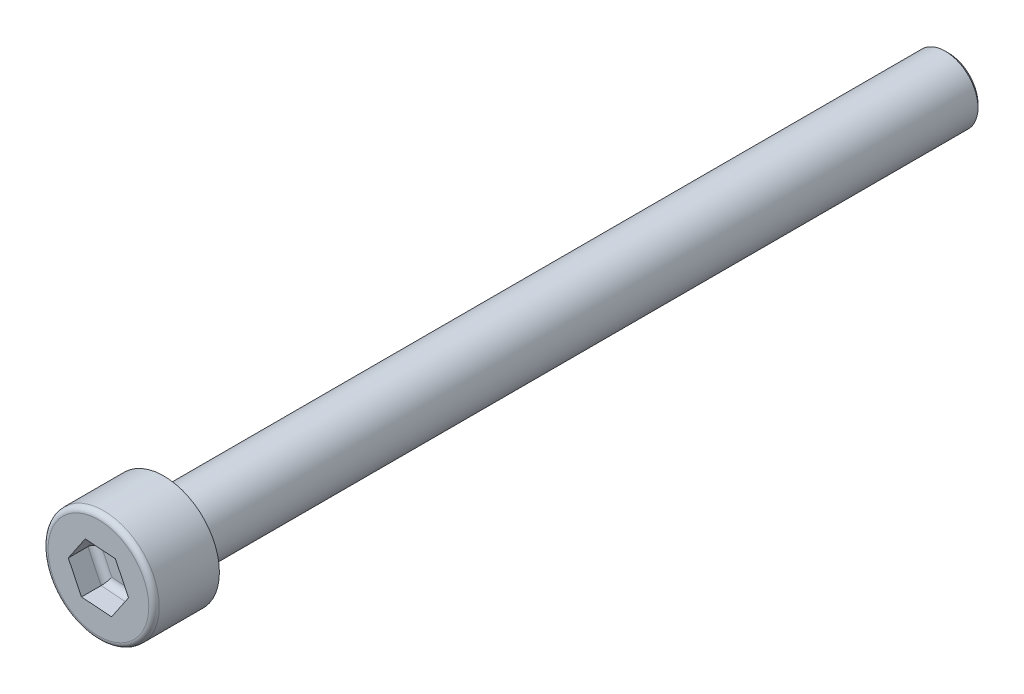
ISO-10303-21;
HEADER;
FILE_DESCRIPTION(('STEP AP214'),'2;1');
FILE_NAME('part.step','',(''),(''),'','','');
FILE_SCHEMA(('AUTOMOTIVE_DESIGN { 1 0 10303 214 1 1 1 1 }'));
ENDSEC;
DATA;
#1=APPLICATION_CONTEXT('core data for automotive mechanical design processes');
#2=APPLICATION_PROTOCOL_DEFINITION('international standard','automotive_design',2000,#1);
#3=PRODUCT_CONTEXT('',#1,'mechanical');
#4=PRODUCT('Part','Part','',(#3));
#5=PRODUCT_RELATED_PRODUCT_CATEGORY('part','',(#4));
#6=PRODUCT_DEFINITION_FORMATION('','',#4);
#7=PRODUCT_DEFINITION_CONTEXT('part definition',#1,'design');
#8=PRODUCT_DEFINITION('design','',#6,#7);
#9=PRODUCT_DEFINITION_SHAPE('','',#8);
#10=(LENGTH_UNIT() NAMED_UNIT(*) SI_UNIT(.MILLI.,.METRE.));
#11=(NAMED_UNIT(*) PLANE_ANGLE_UNIT() SI_UNIT($,.RADIAN.));
#12=(NAMED_UNIT(*) SI_UNIT($,.STERADIAN.) SOLID_ANGLE_UNIT());
#13=UNCERTAINTY_MEASURE_WITH_UNIT(LENGTH_MEASURE(1.E-05),#10,'distance_accuracy_value','');
#14=(GEOMETRIC_REPRESENTATION_CONTEXT(3) GLOBAL_UNCERTAINTY_ASSIGNED_CONTEXT((#13)) GLOBAL_UNIT_ASSIGNED_CONTEXT((#10,
#11,#12)) REPRESENTATION_CONTEXT('',''));
#15=CARTESIAN_POINT('',(0.,0.,0.));
#16=DIRECTION('',(0.,0.,1.));
#17=DIRECTION('',(1.,0.,0.));
#18=AXIS2_PLACEMENT_3D('',#15,#16,#17);
#19=CARTESIAN_POINT('',(0.,0.,60.));
#20=DIRECTION('',(0.,0.,-1.));
#21=DIRECTION('',(-1.,0.,0.));
#22=AXIS2_PLACEMENT_3D('',#19,#20,#21);
#23=CYLINDRICAL_SURFACE('',#22,2.5);
#24=CARTESIAN_POINT('',(0.,0.,0.25));
#25=DIRECTION('',(0.,0.,1.));
#26=DIRECTION('',(1.,0.,0.));
#27=AXIS2_PLACEMENT_3D('',#24,#25,#26);
#28=CIRCLE('',#27,2.5);
#29=CARTESIAN_POINT('',(2.5,0.,0.25));
#30=VERTEX_POINT('',#29);
#31=EDGE_CURVE('E154',#30,#30,#28,.T.);
#32=ORIENTED_EDGE('',*,*,#31,.T.);
#33=EDGE_LOOP('',(#32));
#34=FACE_BOUND('',#33,.T.);
#35=CARTESIAN_POINT('',(0.,0.,60.));
#36=DIRECTION('',(0.,0.,1.));
#37=DIRECTION('',(1.,0.,0.));
#38=AXIS2_PLACEMENT_3D('',#35,#36,#37);
#39=CIRCLE('',#38,2.5);
#40=CARTESIAN_POINT('',(2.5,0.,60.));
#41=VERTEX_POINT('',#40);
#42=EDGE_CURVE('E145',#41,#41,#39,.T.);
#43=ORIENTED_EDGE('',*,*,#42,.F.);
#44=EDGE_LOOP('',(#43));
#45=FACE_BOUND('',#44,.T.);
#46=ADVANCED_FACE('F32',(#34,#45),#23,.T.);
#47=CARTESIAN_POINT('',(0.,0.,0.));
#48=DIRECTION('',(0.,0.,1.));
#49=DIRECTION('',(1.,0.,0.));
#50=AXIS2_PLACEMENT_3D('',#47,#48,#49);
#51=PLANE('',#50);
#52=CARTESIAN_POINT('',(0.,0.,0.));
#53=DIRECTION('',(0.,0.,1.));
#54=DIRECTION('',(1.,0.,0.));
#55=AXIS2_PLACEMENT_3D('',#52,#53,#54);
#56=CIRCLE('',#55,2.25);
#57=CARTESIAN_POINT('',(2.25,0.,0.));
#58=VERTEX_POINT('',#57);
#59=EDGE_CURVE('E157',#58,#58,#56,.F.);
#60=ORIENTED_EDGE('',*,*,#59,.T.);
#61=EDGE_LOOP('',(#60));
#62=FACE_BOUND('',#61,.T.);
#63=ADVANCED_FACE('F247',(#62),#51,.F.);
#64=CARTESIAN_POINT('',(0.,0.,60.));
#65=DIRECTION('',(0.,0.,1.));
#66=DIRECTION('',(1.,0.,0.));
#67=AXIS2_PLACEMENT_3D('',#64,#65,#66);
#68=PLANE('',#67);
#69=CARTESIAN_POINT('',(0.,0.,60.));
#70=DIRECTION('',(0.,0.,1.));
#71=DIRECTION('',(1.,0.,0.));
#72=AXIS2_PLACEMENT_3D('',#69,#70,#71);
#73=CIRCLE('',#72,4.25);
#74=CARTESIAN_POINT('',(4.25,0.,60.));
#75=VERTEX_POINT('',#74);
#76=EDGE_CURVE('E136',#75,#75,#73,.T.);
#77=ORIENTED_EDGE('',*,*,#76,.F.);
#78=EDGE_LOOP('',(#77));
#79=FACE_BOUND('',#78,.T.);
#80=ORIENTED_EDGE('',*,*,#42,.T.);
#81=EDGE_LOOP('',(#80));
#82=FACE_BOUND('',#81,.T.);
#83=ADVANCED_FACE('F253',(#79,#82),#68,.F.);
#84=CARTESIAN_POINT('',(0.,0.,65.));
#85=DIRECTION('',(0.,0.,-1.));
#86=DIRECTION('',(-1.,0.,0.));
#87=AXIS2_PLACEMENT_3D('',#84,#85,#86);
#88=CYLINDRICAL_SURFACE('',#87,4.25);
#89=CARTESIAN_POINT('',(0.,0.,64.6));
#90=DIRECTION('',(0.,0.,1.));
#91=DIRECTION('',(1.,0.,0.));
#92=AXIS2_PLACEMENT_3D('',#89,#90,#91);
#93=CIRCLE('',#92,4.25);
#94=CARTESIAN_POINT('',(4.25,0.,64.6));
#95=VERTEX_POINT('',#94);
#96=EDGE_CURVE('E151',#95,#95,#93,.F.);
#97=ORIENTED_EDGE('',*,*,#96,.T.);
#98=EDGE_LOOP('',(#97));
#99=FACE_BOUND('',#98,.T.);
#100=ORIENTED_EDGE('',*,*,#76,.T.);
#101=EDGE_LOOP('',(#100));
#102=FACE_BOUND('',#101,.T.);
#103=ADVANCED_FACE('F309',(#99,#102),#88,.T.);
#104=CARTESIAN_POINT('',(0.,0.,65.));
#105=DIRECTION('',(0.,0.,1.));
#106=DIRECTION('',(1.,0.,0.));
#107=AXIS2_PLACEMENT_3D('',#104,#105,#106);
#108=PLANE('',#107);
#109=CARTESIAN_POINT('',(0.,0.,65.));
#110=DIRECTION('',(0.,0.,1.));
#111=DIRECTION('',(1.,0.,0.));
#112=AXIS2_PLACEMENT_3D('',#109,#110,#111);
#113=CIRCLE('',#112,3.85);
#114=CARTESIAN_POINT('',(3.85,0.,65.));
#115=VERTEX_POINT('',#114);
#116=EDGE_CURVE('E148',#115,#115,#113,.T.);
#117=ORIENTED_EDGE('',*,*,#116,.T.);
#118=EDGE_LOOP('',(#117));
#119=FACE_BOUND('',#118,.T.);
#120=DIRECTION('',(0.560793935246234,0.827955410750508,0.));
#121=VECTOR('',#120,1.);
#122=CARTESIAN_POINT('',(1.00836176255237,-2.07762842904009,65.));
#123=LINE('',#122,#121);
#124=CARTESIAN_POINT('',(1.00836176255237,-2.07762842904009,65.));
#125=VERTEX_POINT('',#124);
#126=CARTESIAN_POINT('',(2.30345988044966,-0.165547311944842,65.));
#127=VERTEX_POINT('',#126);
#128=EDGE_CURVE('E118',#125,#127,#123,.T.);
#129=ORIENTED_EDGE('',*,*,#128,.F.);
#130=DIRECTION('',(0.997427386533837,-0.0716840888362307,0.));
#131=VECTOR('',#130,1.);
#132=CARTESIAN_POINT('',(-1.29509811789729,-1.91208111709525,65.));
#133=LINE('',#132,#131);
#134=CARTESIAN_POINT('',(-1.29509811789729,-1.91208111709525,65.));
#135=VERTEX_POINT('',#134);
#136=EDGE_CURVE('E131',#135,#125,#133,.T.);
#137=ORIENTED_EDGE('',*,*,#136,.F.);
#138=DIRECTION('',(0.436633451287602,-0.899639499586739,0.));
#139=VECTOR('',#138,1.);
#140=CARTESIAN_POINT('',(-2.30345988044966,0.165547311944843,65.));
#141=LINE('',#140,#139);
#142=CARTESIAN_POINT('',(-2.30345988044966,0.165547311944843,65.));
#143=VERTEX_POINT('',#142);
#144=EDGE_CURVE('E125',#143,#135,#141,.T.);
#145=ORIENTED_EDGE('',*,*,#144,.F.);
#146=DIRECTION('',(-0.560793935246234,-0.827955410750508,0.));
#147=VECTOR('',#146,1.);
#148=CARTESIAN_POINT('',(-1.00836176255237,2.07762842904009,65.));
#149=LINE('',#148,#147);
#150=CARTESIAN_POINT('',(-1.00836176255237,2.07762842904009,65.));
#151=VERTEX_POINT('',#150);
#152=EDGE_CURVE('E123',#151,#143,#149,.T.);
#153=ORIENTED_EDGE('',*,*,#152,.F.);
#154=DIRECTION('',(-0.997427386533836,0.0716840888362302,0.));
#155=VECTOR('',#154,1.);
#156=CARTESIAN_POINT('',(1.29509811789729,1.91208111709525,65.));
#157=LINE('',#156,#155);
#158=CARTESIAN_POINT('',(1.29509811789729,1.91208111709525,65.));
#159=VERTEX_POINT('',#158);
#160=EDGE_CURVE('E106',#159,#151,#157,.T.);
#161=ORIENTED_EDGE('',*,*,#160,.F.);
#162=DIRECTION('',(-0.436633451287602,0.899639499586738,0.));
#163=VECTOR('',#162,1.);
#164=CARTESIAN_POINT('',(2.30345988044966,-0.165547311944842,65.));
#165=LINE('',#164,#163);
#166=EDGE_CURVE('E113',#127,#159,#165,.T.);
#167=ORIENTED_EDGE('',*,*,#166,.F.);
#168=EDGE_LOOP('',(#129,#137,#145,#153,#161,#167));
#169=FACE_BOUND('',#168,.T.);
#170=ADVANCED_FACE('F120',(#119,#169),#108,.T.);
#171=CARTESIAN_POINT('',(1.00836176255237,-2.07762842904009,63.));
#172=DIRECTION('',(0.827955410750508,-0.560793935246234,0.));
#173=DIRECTION('',(0.560793935246234,0.827955410750508,0.));
#174=AXIS2_PLACEMENT_3D('',#171,#172,#173);
#175=PLANE('',#174);
#176=DIRECTION('',(0.,0.,1.));
#177=VECTOR('',#176,1.);
#178=CARTESIAN_POINT('',(2.30345988044966,-0.165547311944842,63.));
#179=LINE('',#178,#177);
#180=CARTESIAN_POINT('',(2.30345988044966,-0.165547311944842,63.5));
#181=VERTEX_POINT('',#180);
#182=EDGE_CURVE('E110',#181,#127,#179,.T.);
#183=ORIENTED_EDGE('',*,*,#182,.F.);
#184=DIRECTION('',(0.560793935246234,0.827955410750508,0.));
#185=VECTOR('',#184,1.);
#186=CARTESIAN_POINT('',(1.00836176255237,-2.07762842904009,63.5));
#187=LINE('',#186,#185);
#188=CARTESIAN_POINT('',(1.00836176255237,-2.07762842904009,63.5));
#189=VERTEX_POINT('',#188);
#190=EDGE_CURVE('E11',#181,#189,#187,.F.);
#191=ORIENTED_EDGE('',*,*,#190,.T.);
#192=DIRECTION('',(0.,0.,1.));
#193=VECTOR('',#192,1.);
#194=CARTESIAN_POINT('',(1.00836176255237,-2.07762842904009,63.));
#195=LINE('',#194,#193);
#196=EDGE_CURVE('E134',#189,#125,#195,.T.);
#197=ORIENTED_EDGE('',*,*,#196,.T.);
#198=ORIENTED_EDGE('',*,*,#128,.T.);
#199=EDGE_LOOP('',(#183,#191,#197,#198));
#200=FACE_BOUND('',#199,.T.);
#201=ADVANCED_FACE('F201',(#200),#175,.F.);
#202=CARTESIAN_POINT('',(-1.29509811789729,-1.91208111709525,63.));
#203=DIRECTION('',(-0.0716840888362307,-0.997427386533837,0.));
#204=DIRECTION('',(0.997427386533837,-0.0716840888362307,0.));
#205=AXIS2_PLACEMENT_3D('',#202,#203,#204);
#206=PLANE('',#205);
#207=ORIENTED_EDGE('',*,*,#196,.F.);
#208=DIRECTION('',(0.997427386533837,-0.0716840888362307,0.));
#209=VECTOR('',#208,1.);
#210=CARTESIAN_POINT('',(-1.29509811789729,-1.91208111709525,63.5));
#211=LINE('',#210,#209);
#212=CARTESIAN_POINT('',(-1.29509811789729,-1.91208111709525,63.5));
#213=VERTEX_POINT('',#212);
#214=EDGE_CURVE('E173',#189,#213,#211,.F.);
#215=ORIENTED_EDGE('',*,*,#214,.T.);
#216=DIRECTION('',(0.,0.,1.));
#217=VECTOR('',#216,1.);
#218=CARTESIAN_POINT('',(-1.29509811789729,-1.91208111709525,63.));
#219=LINE('',#218,#217);
#220=EDGE_CURVE('E137',#213,#135,#219,.T.);
#221=ORIENTED_EDGE('',*,*,#220,.T.);
#222=ORIENTED_EDGE('',*,*,#136,.T.);
#223=EDGE_LOOP('',(#207,#215,#221,#222));
#224=FACE_BOUND('',#223,.T.);
#225=ADVANCED_FACE('F206',(#224),#206,.F.);
#226=CARTESIAN_POINT('',(-2.30345988044966,0.165547311944843,63.));
#227=DIRECTION('',(-0.899639499586739,-0.436633451287602,0.));
#228=DIRECTION('',(0.436633451287602,-0.899639499586739,0.));
#229=AXIS2_PLACEMENT_3D('',#226,#227,#228);
#230=PLANE('',#229);
#231=ORIENTED_EDGE('',*,*,#220,.F.);
#232=DIRECTION('',(0.436633451287602,-0.899639499586739,0.));
#233=VECTOR('',#232,1.);
#234=CARTESIAN_POINT('',(-2.30345988044966,0.165547311944843,63.5));
#235=LINE('',#234,#233);
#236=CARTESIAN_POINT('',(-2.30345988044966,0.165547311944843,63.5));
#237=VERTEX_POINT('',#236);
#238=EDGE_CURVE('E176',#213,#237,#235,.F.);
#239=ORIENTED_EDGE('',*,*,#238,.T.);
#240=DIRECTION('',(0.,0.,1.));
#241=VECTOR('',#240,1.);
#242=CARTESIAN_POINT('',(-2.30345988044966,0.165547311944843,63.));
#243=LINE('',#242,#241);
#244=EDGE_CURVE('E139',#237,#143,#243,.T.);
#245=ORIENTED_EDGE('',*,*,#244,.T.);
#246=ORIENTED_EDGE('',*,*,#144,.T.);
#247=EDGE_LOOP('',(#231,#239,#245,#246));
#248=FACE_BOUND('',#247,.T.);
#249=ADVANCED_FACE('F210',(#248),#230,.F.);
#250=CARTESIAN_POINT('',(-1.00836176255237,2.07762842904009,63.));
#251=DIRECTION('',(-0.827955410750508,0.560793935246234,0.));
#252=DIRECTION('',(-0.560793935246234,-0.827955410750508,0.));
#253=AXIS2_PLACEMENT_3D('',#250,#251,#252);
#254=PLANE('',#253);
#255=ORIENTED_EDGE('',*,*,#244,.F.);
#256=DIRECTION('',(-0.560793935246234,-0.827955410750508,0.));
#257=VECTOR('',#256,1.);
#258=CARTESIAN_POINT('',(-1.00836176255237,2.07762842904009,63.5));
#259=LINE('',#258,#257);
#260=CARTESIAN_POINT('',(-1.00836176255237,2.07762842904009,63.5));
#261=VERTEX_POINT('',#260);
#262=EDGE_CURVE('E178',#237,#261,#259,.F.);
#263=ORIENTED_EDGE('',*,*,#262,.T.);
#264=DIRECTION('',(0.,0.,1.));
#265=VECTOR('',#264,1.);
#266=CARTESIAN_POINT('',(-1.00836176255237,2.07762842904009,63.));
#267=LINE('',#266,#265);
#268=EDGE_CURVE('E109',#261,#151,#267,.T.);
#269=ORIENTED_EDGE('',*,*,#268,.T.);
#270=ORIENTED_EDGE('',*,*,#152,.T.);
#271=EDGE_LOOP('',(#255,#263,#269,#270));
#272=FACE_BOUND('',#271,.T.);
#273=ADVANCED_FACE('F214',(#272),#254,.F.);
#274=CARTESIAN_POINT('',(1.29509811789729,1.91208111709525,63.));
#275=DIRECTION('',(0.0716840888362302,0.997427386533837,0.));
#276=DIRECTION('',(-0.997427386533837,0.0716840888362302,0.));
#277=AXIS2_PLACEMENT_3D('',#274,#275,#276);
#278=PLANE('',#277);
#279=ORIENTED_EDGE('',*,*,#268,.F.);
#280=DIRECTION('',(-0.997427386533837,0.0716840888362302,0.));
#281=VECTOR('',#280,1.);
#282=CARTESIAN_POINT('',(1.29509811789729,1.91208111709525,63.5));
#283=LINE('',#282,#281);
#284=CARTESIAN_POINT('',(1.29509811789729,1.91208111709525,63.5));
#285=VERTEX_POINT('',#284);
#286=EDGE_CURVE('E56',#261,#285,#283,.F.);
#287=ORIENTED_EDGE('',*,*,#286,.T.);
#288=DIRECTION('',(0.,0.,1.));
#289=VECTOR('',#288,1.);
#290=CARTESIAN_POINT('',(1.29509811789729,1.91208111709525,63.));
#291=LINE('',#290,#289);
#292=EDGE_CURVE('E102',#285,#159,#291,.T.);
#293=ORIENTED_EDGE('',*,*,#292,.T.);
#294=ORIENTED_EDGE('',*,*,#160,.T.);
#295=EDGE_LOOP('',(#279,#287,#293,#294));
#296=FACE_BOUND('',#295,.T.);
#297=ADVANCED_FACE('F104',(#296),#278,.F.);
#298=CARTESIAN_POINT('',(2.30345988044966,-0.165547311944842,63.));
#299=DIRECTION('',(0.899639499586738,0.436633451287602,0.));
#300=DIRECTION('',(-0.436633451287602,0.899639499586738,0.));
#301=AXIS2_PLACEMENT_3D('',#298,#299,#300);
#302=PLANE('',#301);
#303=ORIENTED_EDGE('',*,*,#292,.F.);
#304=DIRECTION('',(-0.436633451287602,0.899639499586738,0.));
#305=VECTOR('',#304,1.);
#306=CARTESIAN_POINT('',(2.30345988044966,-0.165547311944842,63.5));
#307=LINE('',#306,#305);
#308=EDGE_CURVE('E41',#285,#181,#307,.F.);
#309=ORIENTED_EDGE('',*,*,#308,.T.);
#310=ORIENTED_EDGE('',*,*,#182,.T.);
#311=ORIENTED_EDGE('',*,*,#166,.T.);
#312=EDGE_LOOP('',(#303,#309,#310,#311));
#313=FACE_BOUND('',#312,.T.);
#314=ADVANCED_FACE('F114',(#313),#302,.F.);
#315=CARTESIAN_POINT('',(0.,0.,63.));
#316=DIRECTION('',(0.,0.,1.));
#317=DIRECTION('',(1.,0.,0.));
#318=AXIS2_PLACEMENT_3D('',#315,#316,#317);
#319=PLANE('',#318);
#320=DIRECTION('',(0.436633451287602,-0.899639499586739,0.));
#321=VECTOR('',#320,1.);
#322=CARTESIAN_POINT('',(-1.34945924938011,-0.654950176931403,63.));
#323=LINE('',#322,#321);
#324=CARTESIAN_POINT('',(-1.72759491033725,0.124160483958632,63.));
#325=VERTEX_POINT('',#324);
#326=CARTESIAN_POINT('',(-0.971323588422969,-1.43406083782144,63.));
#327=VERTEX_POINT('',#326);
#328=EDGE_CURVE('E168',#325,#327,#323,.T.);
#329=ORIENTED_EDGE('',*,*,#328,.T.);
#330=DIRECTION('',(0.997427386533837,-0.0716840888362307,0.));
#331=VECTOR('',#330,1.);
#332=CARTESIAN_POINT('',(-0.107526133254346,-1.49614107980075,63.));
#333=LINE('',#332,#331);
#334=CARTESIAN_POINT('',(0.756271321914277,-1.55822132178007,63.));
#335=VERTEX_POINT('',#334);
#336=EDGE_CURVE('E170',#327,#335,#333,.T.);
#337=ORIENTED_EDGE('',*,*,#336,.T.);
#338=DIRECTION('',(0.560793935246234,0.827955410750508,0.));
#339=VECTOR('',#338,1.);
#340=CARTESIAN_POINT('',(1.24193311612576,-0.841190902869351,63.));
#341=LINE('',#340,#339);
#342=CARTESIAN_POINT('',(1.72759491033725,-0.124160483958632,63.));
#343=VERTEX_POINT('',#342);
#344=EDGE_CURVE('E160',#335,#343,#341,.T.);
#345=ORIENTED_EDGE('',*,*,#344,.T.);
#346=DIRECTION('',(-0.436633451287602,0.899639499586738,0.));
#347=VECTOR('',#346,1.);
#348=CARTESIAN_POINT('',(1.34945924938011,0.654950176931404,63.));
#349=LINE('',#348,#347);
#350=CARTESIAN_POINT('',(0.971323588422969,1.43406083782144,63.));
#351=VERTEX_POINT('',#350);
#352=EDGE_CURVE('E162',#343,#351,#349,.T.);
#353=ORIENTED_EDGE('',*,*,#352,.T.);
#354=DIRECTION('',(-0.997427386533837,0.0716840888362302,0.));
#355=VECTOR('',#354,1.);
#356=CARTESIAN_POINT('',(0.107526133254345,1.49614107980075,63.));
#357=LINE('',#356,#355);
#358=CARTESIAN_POINT('',(-0.756271321914277,1.55822132178007,63.));
#359=VERTEX_POINT('',#358);
#360=EDGE_CURVE('E164',#351,#359,#357,.T.);
#361=ORIENTED_EDGE('',*,*,#360,.T.);
#362=DIRECTION('',(-0.560793935246234,-0.827955410750508,0.));
#363=VECTOR('',#362,1.);
#364=CARTESIAN_POINT('',(-1.24193311612576,0.841190902869351,63.));
#365=LINE('',#364,#363);
#366=EDGE_CURVE('E166',#359,#325,#365,.T.);
#367=ORIENTED_EDGE('',*,*,#366,.T.);
#368=EDGE_LOOP('',(#329,#337,#345,#353,#361,#367));
#369=FACE_BOUND('',#368,.T.);
#370=ADVANCED_FACE('F233',(#369),#319,.T.);
#371=CARTESIAN_POINT('',(0.,0.,64.6));
#372=DIRECTION('',(0.,0.,1.));
#373=DIRECTION('',(1.,0.,0.));
#374=AXIS2_PLACEMENT_3D('',#371,#372,#373);
#375=TOROIDAL_SURFACE('',#374,3.85,0.4);
#376=ORIENTED_EDGE('',*,*,#96,.F.);
#377=EDGE_LOOP('',(#376));
#378=FACE_BOUND('',#377,.T.);
#379=ORIENTED_EDGE('',*,*,#116,.F.);
#380=EDGE_LOOP('',(#379));
#381=FACE_BOUND('',#380,.T.);
#382=ADVANCED_FACE('F235',(#378,#381),#375,.T.);
#383=CARTESIAN_POINT('',(0.,0.,0.25));
#384=DIRECTION('',(0.,0.,1.));
#385=DIRECTION('',(1.,0.,0.));
#386=AXIS2_PLACEMENT_3D('',#383,#384,#385);
#387=CONICAL_SURFACE('',#386,2.5,0.785398163397458);
#388=ORIENTED_EDGE('',*,*,#59,.F.);
#389=EDGE_LOOP('',(#388));
#390=FACE_BOUND('',#389,.T.);
#391=ORIENTED_EDGE('',*,*,#31,.F.);
#392=EDGE_LOOP('',(#391));
#393=FACE_BOUND('',#392,.T.);
#394=ADVANCED_FACE('F241',(#390,#393),#387,.T.);
#395=CARTESIAN_POINT('',(0.107526133254345,1.49614107980075,63.5));
#396=DIRECTION('',(-0.997427386533837,0.0716840888362302,0.));
#397=DIRECTION('',(-0.0716840888362302,-0.997427386533837,0.));
#398=AXIS2_PLACEMENT_3D('',#395,#396,#397);
#399=CYLINDRICAL_SURFACE('',#398,0.5);
#400=CARTESIAN_POINT('',(0.971323588422969,1.43406083782144,63.5));
#401=DIRECTION('',(-0.827955410750508,0.560793935246234,0.));
#402=DIRECTION('',(-0.560793935246234,-0.827955410750508,0.));
#403=AXIS2_PLACEMENT_3D('',#400,#401,#402);
#404=ELLIPSE('',#403,0.577350269189626,0.5);
#405=EDGE_CURVE('E191',#285,#351,#404,.T.);
#406=ORIENTED_EDGE('',*,*,#405,.F.);
#407=ORIENTED_EDGE('',*,*,#286,.F.);
#408=CARTESIAN_POINT('',(-0.756271321914277,1.55822132178007,63.5));
#409=DIRECTION('',(-0.899639499586738,-0.436633451287602,0.));
#410=DIRECTION('',(0.436633451287602,-0.899639499586738,0.));
#411=AXIS2_PLACEMENT_3D('',#408,#409,#410);
#412=ELLIPSE('',#411,0.577350269189626,0.5);
#413=EDGE_CURVE('E36',#359,#261,#412,.F.);
#414=ORIENTED_EDGE('',*,*,#413,.F.);
#415=ORIENTED_EDGE('',*,*,#360,.F.);
#416=EDGE_LOOP('',(#406,#407,#414,#415));
#417=FACE_BOUND('',#416,.T.);
#418=ADVANCED_FACE('F34',(#417),#399,.F.);
#419=CARTESIAN_POINT('',(-1.24193311612576,0.841190902869351,63.5));
#420=DIRECTION('',(-0.560793935246234,-0.827955410750508,0.));
#421=DIRECTION('',(0.827955410750508,-0.560793935246234,0.));
#422=AXIS2_PLACEMENT_3D('',#419,#420,#421);
#423=CYLINDRICAL_SURFACE('',#422,0.5);
#424=ORIENTED_EDGE('',*,*,#413,.T.);
#425=ORIENTED_EDGE('',*,*,#262,.F.);
#426=CARTESIAN_POINT('',(-1.72759491033725,0.124160483958632,63.5));
#427=DIRECTION('',(-0.0716840888362305,-0.997427386533837,0.));
#428=DIRECTION('',(0.997427386533837,-0.0716840888362306,0.));
#429=AXIS2_PLACEMENT_3D('',#426,#427,#428);
#430=ELLIPSE('',#429,0.577350269189626,0.5);
#431=EDGE_CURVE('E189',#325,#237,#430,.F.);
#432=ORIENTED_EDGE('',*,*,#431,.F.);
#433=ORIENTED_EDGE('',*,*,#366,.F.);
#434=EDGE_LOOP('',(#424,#425,#432,#433));
#435=FACE_BOUND('',#434,.T.);
#436=ADVANCED_FACE('F231',(#435),#423,.F.);
#437=CARTESIAN_POINT('',(1.34945924938011,0.654950176931404,63.5));
#438=DIRECTION('',(-0.436633451287602,0.899639499586738,0.));
#439=DIRECTION('',(-0.899639499586738,-0.436633451287602,0.));
#440=AXIS2_PLACEMENT_3D('',#437,#438,#439);
#441=CYLINDRICAL_SURFACE('',#440,0.5);
#442=ORIENTED_EDGE('',*,*,#405,.T.);
#443=ORIENTED_EDGE('',*,*,#352,.F.);
#444=CARTESIAN_POINT('',(1.72759491033725,-0.124160483958632,63.5));
#445=DIRECTION('',(0.0716840888362303,0.997427386533837,0.));
#446=DIRECTION('',(-0.997427386533837,0.0716840888362304,0.));
#447=AXIS2_PLACEMENT_3D('',#444,#445,#446);
#448=ELLIPSE('',#447,0.577350269189626,0.5);
#449=EDGE_CURVE('E186',#181,#343,#448,.T.);
#450=ORIENTED_EDGE('',*,*,#449,.F.);
#451=ORIENTED_EDGE('',*,*,#308,.F.);
#452=EDGE_LOOP('',(#442,#443,#450,#451));
#453=FACE_BOUND('',#452,.T.);
#454=ADVANCED_FACE('F217',(#453),#441,.F.);
#455=CARTESIAN_POINT('',(-1.34945924938011,-0.654950176931403,63.5));
#456=DIRECTION('',(0.436633451287602,-0.899639499586739,0.));
#457=DIRECTION('',(0.899639499586739,0.436633451287602,0.));
#458=AXIS2_PLACEMENT_3D('',#455,#456,#457);
#459=CYLINDRICAL_SURFACE('',#458,0.5);
#460=ORIENTED_EDGE('',*,*,#431,.T.);
#461=ORIENTED_EDGE('',*,*,#238,.F.);
#462=CARTESIAN_POINT('',(-0.971323588422969,-1.43406083782144,63.5));
#463=DIRECTION('',(0.827955410750508,-0.560793935246234,0.));
#464=DIRECTION('',(0.560793935246234,0.827955410750508,0.));
#465=AXIS2_PLACEMENT_3D('',#462,#463,#464);
#466=ELLIPSE('',#465,0.577350269189626,0.5);
#467=EDGE_CURVE('E184',#327,#213,#466,.F.);
#468=ORIENTED_EDGE('',*,*,#467,.F.);
#469=ORIENTED_EDGE('',*,*,#328,.F.);
#470=EDGE_LOOP('',(#460,#461,#468,#469));
#471=FACE_BOUND('',#470,.T.);
#472=ADVANCED_FACE('F229',(#471),#459,.F.);
#473=CARTESIAN_POINT('',(1.24193311612576,-0.841190902869351,63.5));
#474=DIRECTION('',(0.560793935246234,0.827955410750508,0.));
#475=DIRECTION('',(-0.827955410750508,0.560793935246234,0.));
#476=AXIS2_PLACEMENT_3D('',#473,#474,#475);
#477=CYLINDRICAL_SURFACE('',#476,0.5);
#478=ORIENTED_EDGE('',*,*,#449,.T.);
#479=ORIENTED_EDGE('',*,*,#344,.F.);
#480=CARTESIAN_POINT('',(0.756271321914278,-1.55822132178007,63.5));
#481=DIRECTION('',(0.899639499586739,0.436633451287602,0.));
#482=DIRECTION('',(0.436633451287602,-0.899639499586739,0.));
#483=AXIS2_PLACEMENT_3D('',#480,#481,#482);
#484=ELLIPSE('',#483,0.577350269189626,0.5);
#485=EDGE_CURVE('E182',#189,#335,#484,.T.);
#486=ORIENTED_EDGE('',*,*,#485,.F.);
#487=ORIENTED_EDGE('',*,*,#190,.F.);
#488=EDGE_LOOP('',(#478,#479,#486,#487));
#489=FACE_BOUND('',#488,.T.);
#490=ADVANCED_FACE('F222',(#489),#477,.F.);
#491=CARTESIAN_POINT('',(-0.107526133254346,-1.49614107980075,63.5));
#492=DIRECTION('',(0.997427386533837,-0.0716840888362307,0.));
#493=DIRECTION('',(0.0716840888362307,0.997427386533837,0.));
#494=AXIS2_PLACEMENT_3D('',#491,#492,#493);
#495=CYLINDRICAL_SURFACE('',#494,0.5);
#496=ORIENTED_EDGE('',*,*,#467,.T.);
#497=ORIENTED_EDGE('',*,*,#214,.F.);
#498=ORIENTED_EDGE('',*,*,#485,.T.);
#499=ORIENTED_EDGE('',*,*,#336,.F.);
#500=EDGE_LOOP('',(#496,#497,#498,#499));
#501=FACE_BOUND('',#500,.T.);
#502=ADVANCED_FACE('F225',(#501),#495,.F.);
#503=CLOSED_SHELL('',(#46,#63,#83,#103,#170,#201,#225,#249,#273,#297,#314,#370,#382,#394,#418,
#436,#454,#472,#490,#502));
#504=MANIFOLD_SOLID_BREP('B2',#503);
#505=ADVANCED_BREP_SHAPE_REPRESENTATION('',(#18,#504),#14);
#506=SHAPE_DEFINITION_REPRESENTATION(#9,#505);
ENDSEC;
END-ISO-10303-21;
